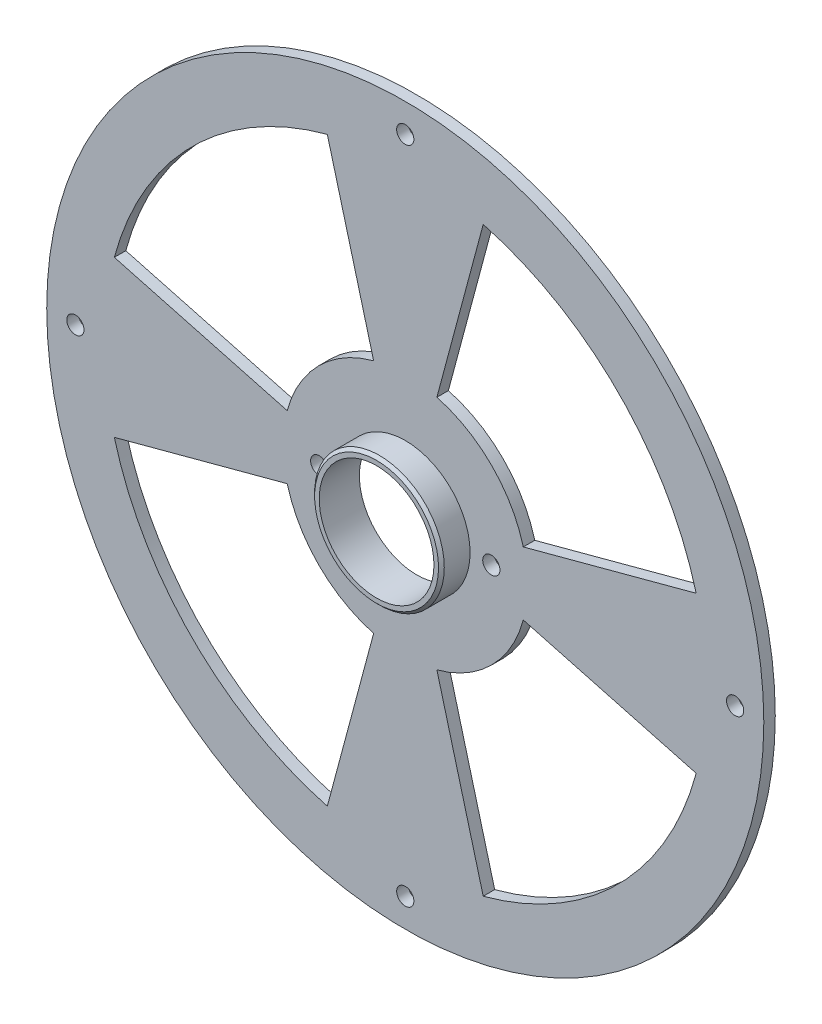
ISO-10303-21;
HEADER;
FILE_DESCRIPTION(('STEP AP214'),'2;1');
FILE_NAME('part.step','',(''),(''),'','','');
FILE_SCHEMA(('AUTOMOTIVE_DESIGN { 1 0 10303 214 1 1 1 1 }'));
ENDSEC;
DATA;
#1=APPLICATION_CONTEXT('core data for automotive mechanical design processes');
#2=APPLICATION_PROTOCOL_DEFINITION('international standard','automotive_design',2000,#1);
#3=PRODUCT_CONTEXT('',#1,'mechanical');
#4=PRODUCT('Part','Part','',(#3));
#5=PRODUCT_RELATED_PRODUCT_CATEGORY('part','',(#4));
#6=PRODUCT_DEFINITION_FORMATION('','',#4);
#7=PRODUCT_DEFINITION_CONTEXT('part definition',#1,'design');
#8=PRODUCT_DEFINITION('design','',#6,#7);
#9=PRODUCT_DEFINITION_SHAPE('','',#8);
#10=(LENGTH_UNIT() NAMED_UNIT(*) SI_UNIT(.MILLI.,.METRE.));
#11=(NAMED_UNIT(*) PLANE_ANGLE_UNIT() SI_UNIT($,.RADIAN.));
#12=(NAMED_UNIT(*) SI_UNIT($,.STERADIAN.) SOLID_ANGLE_UNIT());
#13=UNCERTAINTY_MEASURE_WITH_UNIT(LENGTH_MEASURE(1.E-05),#10,'distance_accuracy_value','');
#14=(GEOMETRIC_REPRESENTATION_CONTEXT(3) GLOBAL_UNCERTAINTY_ASSIGNED_CONTEXT((#13)) GLOBAL_UNIT_ASSIGNED_CONTEXT((#10,
#11,#12)) REPRESENTATION_CONTEXT('',''));
#15=CARTESIAN_POINT('',(0.,0.,0.));
#16=DIRECTION('',(0.,0.,1.));
#17=DIRECTION('',(1.,0.,0.));
#18=AXIS2_PLACEMENT_3D('',#15,#16,#17);
#19=CARTESIAN_POINT('',(0.,0.,2.));
#20=DIRECTION('',(0.,0.,1.));
#21=DIRECTION('',(1.,0.,0.));
#22=AXIS2_PLACEMENT_3D('',#19,#20,#21);
#23=PLANE('',#22);
#24=CARTESIAN_POINT('',(0.,0.,2.));
#25=DIRECTION('',(0.,0.,1.));
#26=DIRECTION('',(1.,0.,0.));
#27=AXIS2_PLACEMENT_3D('',#24,#25,#26);
#28=CIRCLE('',#27,52.5);
#29=CARTESIAN_POINT('',(-50.7111058801761,-13.5879998678824,2.));
#30=VERTEX_POINT('',#29);
#31=CARTESIAN_POINT('',(-13.587999867882,-50.7111058801762,2.));
#32=VERTEX_POINT('',#31);
#33=EDGE_CURVE('E50',#30,#32,#28,.T.);
#34=ORIENTED_EDGE('',*,*,#33,.F.);
#35=DIRECTION('',(-0.965925826289068,-0.258819045102522,0.));
#36=VECTOR('',#35,1.);
#37=CARTESIAN_POINT('',(-20.5742200999571,-5.51284566068371,2.));
#38=LINE('',#37,#36);
#39=CARTESIAN_POINT('',(-20.5742200999572,-5.5128456606837,2.));
#40=VERTEX_POINT('',#39);
#41=EDGE_CURVE('E169',#40,#30,#38,.T.);
#42=ORIENTED_EDGE('',*,*,#41,.F.);
#43=CARTESIAN_POINT('',(0.,0.,2.));
#44=DIRECTION('',(0.,0.,-1.));
#45=DIRECTION('',(1.,0.,0.));
#46=AXIS2_PLACEMENT_3D('',#43,#44,#45);
#47=CIRCLE('',#46,21.3);
#48=CARTESIAN_POINT('',(-5.51284566068355,-20.5742200999572,2.));
#49=VERTEX_POINT('',#48);
#50=EDGE_CURVE('E172',#49,#40,#47,.T.);
#51=ORIENTED_EDGE('',*,*,#50,.F.);
#52=DIRECTION('',(0.258819045102514,0.96592582628907,0.));
#53=VECTOR('',#52,1.);
#54=CARTESIAN_POINT('',(-5.51284566068355,-20.5742200999572,2.));
#55=LINE('',#54,#53);
#56=EDGE_CURVE('E181',#32,#49,#55,.T.);
#57=ORIENTED_EDGE('',*,*,#56,.F.);
#58=EDGE_LOOP('',(#34,#42,#51,#57));
#59=FACE_BOUND('',#58,.T.);
#60=CARTESIAN_POINT('',(0.,0.,2.));
#61=DIRECTION('',(0.,0.,1.));
#62=DIRECTION('',(1.,0.,0.));
#63=AXIS2_PLACEMENT_3D('',#60,#61,#62);
#64=CIRCLE('',#63,52.5);
#65=CARTESIAN_POINT('',(-13.5879998678824,50.7111058801761,2.));
#66=VERTEX_POINT('',#65);
#67=CARTESIAN_POINT('',(-50.7111058801762,13.587999867882,2.));
#68=VERTEX_POINT('',#67);
#69=EDGE_CURVE('E58',#66,#68,#64,.T.);
#70=ORIENTED_EDGE('',*,*,#69,.F.);
#71=DIRECTION('',(-0.258819045102522,0.965925826289068,0.));
#72=VECTOR('',#71,1.);
#73=CARTESIAN_POINT('',(-5.51284566068371,20.5742200999571,2.));
#74=LINE('',#73,#72);
#75=CARTESIAN_POINT('',(-5.51284566068371,20.5742200999572,2.));
#76=VERTEX_POINT('',#75);
#77=EDGE_CURVE('E196',#76,#66,#74,.T.);
#78=ORIENTED_EDGE('',*,*,#77,.F.);
#79=CARTESIAN_POINT('',(0.,0.,2.));
#80=DIRECTION('',(0.,0.,-1.));
#81=DIRECTION('',(1.,0.,0.));
#82=AXIS2_PLACEMENT_3D('',#79,#80,#81);
#83=CIRCLE('',#82,21.3);
#84=CARTESIAN_POINT('',(-20.5742200999572,5.51284566068355,2.));
#85=VERTEX_POINT('',#84);
#86=EDGE_CURVE('E211',#85,#76,#83,.T.);
#87=ORIENTED_EDGE('',*,*,#86,.F.);
#88=DIRECTION('',(0.96592582628907,-0.258819045102514,0.));
#89=VECTOR('',#88,1.);
#90=CARTESIAN_POINT('',(-20.5742200999572,5.51284566068355,2.));
#91=LINE('',#90,#89);
#92=EDGE_CURVE('E207',#68,#85,#91,.T.);
#93=ORIENTED_EDGE('',*,*,#92,.F.);
#94=EDGE_LOOP('',(#70,#78,#87,#93));
#95=FACE_BOUND('',#94,.T.);
#96=CARTESIAN_POINT('',(0.,0.,2.));
#97=DIRECTION('',(0.,0.,1.));
#98=DIRECTION('',(1.,0.,0.));
#99=AXIS2_PLACEMENT_3D('',#96,#97,#98);
#100=CIRCLE('',#99,52.5);
#101=CARTESIAN_POINT('',(50.7111058801761,13.5879998678824,2.));
#102=VERTEX_POINT('',#101);
#103=CARTESIAN_POINT('',(13.587999867882,50.7111058801762,2.));
#104=VERTEX_POINT('',#103);
#105=EDGE_CURVE('E236',#102,#104,#100,.T.);
#106=ORIENTED_EDGE('',*,*,#105,.F.);
#107=DIRECTION('',(0.965925826289068,0.258819045102522,0.));
#108=VECTOR('',#107,1.);
#109=CARTESIAN_POINT('',(20.5742200999571,5.51284566068371,2.));
#110=LINE('',#109,#108);
#111=CARTESIAN_POINT('',(20.5742200999571,5.51284566068371,2.));
#112=VERTEX_POINT('',#111);
#113=EDGE_CURVE('E226',#112,#102,#110,.T.);
#114=ORIENTED_EDGE('',*,*,#113,.F.);
#115=CARTESIAN_POINT('',(0.,0.,2.));
#116=DIRECTION('',(0.,0.,-1.));
#117=DIRECTION('',(1.,0.,0.));
#118=AXIS2_PLACEMENT_3D('',#115,#116,#117);
#119=CIRCLE('',#118,21.3);
#120=CARTESIAN_POINT('',(5.51284566068355,20.5742200999572,2.));
#121=VERTEX_POINT('',#120);
#122=EDGE_CURVE('E242',#121,#112,#119,.T.);
#123=ORIENTED_EDGE('',*,*,#122,.F.);
#124=DIRECTION('',(-0.258819045102514,-0.96592582628907,0.));
#125=VECTOR('',#124,1.);
#126=CARTESIAN_POINT('',(5.51284566068355,20.5742200999572,2.));
#127=LINE('',#126,#125);
#128=EDGE_CURVE('E238',#104,#121,#127,.T.);
#129=ORIENTED_EDGE('',*,*,#128,.F.);
#130=EDGE_LOOP('',(#106,#114,#123,#129));
#131=FACE_BOUND('',#130,.T.);
#132=CARTESIAN_POINT('',(0.,0.,2.));
#133=DIRECTION('',(0.,0.,1.));
#134=DIRECTION('',(1.,0.,0.));
#135=AXIS2_PLACEMENT_3D('',#132,#133,#134);
#136=CIRCLE('',#135,52.5);
#137=CARTESIAN_POINT('',(13.5879998678824,-50.7111058801761,2.));
#138=VERTEX_POINT('',#137);
#139=CARTESIAN_POINT('',(50.7111058801762,-13.587999867882,2.));
#140=VERTEX_POINT('',#139);
#141=EDGE_CURVE('E188',#138,#140,#136,.T.);
#142=ORIENTED_EDGE('',*,*,#141,.F.);
#143=DIRECTION('',(0.258819045102522,-0.965925826289068,0.));
#144=VECTOR('',#143,1.);
#145=CARTESIAN_POINT('',(5.51284566068371,-20.5742200999571,2.));
#146=LINE('',#145,#144);
#147=CARTESIAN_POINT('',(5.5128456606837,-20.5742200999572,2.));
#148=VERTEX_POINT('',#147);
#149=EDGE_CURVE('E258',#148,#138,#146,.T.);
#150=ORIENTED_EDGE('',*,*,#149,.F.);
#151=CARTESIAN_POINT('',(0.,0.,2.));
#152=DIRECTION('',(0.,0.,-1.));
#153=DIRECTION('',(1.,0.,0.));
#154=AXIS2_PLACEMENT_3D('',#151,#152,#153);
#155=CIRCLE('',#154,21.3);
#156=CARTESIAN_POINT('',(20.5742200999572,-5.51284566068355,2.));
#157=VERTEX_POINT('',#156);
#158=EDGE_CURVE('E272',#157,#148,#155,.T.);
#159=ORIENTED_EDGE('',*,*,#158,.F.);
#160=DIRECTION('',(-0.96592582628907,0.258819045102514,0.));
#161=VECTOR('',#160,1.);
#162=CARTESIAN_POINT('',(20.5742200999572,-5.51284566068355,2.));
#163=LINE('',#162,#161);
#164=EDGE_CURVE('E269',#140,#157,#163,.T.);
#165=ORIENTED_EDGE('',*,*,#164,.F.);
#166=EDGE_LOOP('',(#142,#150,#159,#165));
#167=FACE_BOUND('',#166,.T.);
#168=CARTESIAN_POINT('',(0.,0.,2.));
#169=DIRECTION('',(0.,0.,1.));
#170=DIRECTION('',(1.,0.,0.));
#171=AXIS2_PLACEMENT_3D('',#168,#169,#170);
#172=CIRCLE('',#171,11.3);
#173=CARTESIAN_POINT('',(11.3,0.,2.));
#174=VERTEX_POINT('',#173);
#175=EDGE_CURVE('E279',#174,#174,#172,.T.);
#176=ORIENTED_EDGE('',*,*,#175,.F.);
#177=EDGE_LOOP('',(#176));
#178=FACE_BOUND('',#177,.T.);
#179=CARTESIAN_POINT('',(-5.95238811855343E-13,-57.5,2.));
#180=DIRECTION('',(0.,0.,1.));
#181=DIRECTION('',(1.,0.,0.));
#182=AXIS2_PLACEMENT_3D('',#179,#180,#181);
#183=CIRCLE('',#182,1.50000000000001);
#184=CARTESIAN_POINT('',(1.49999999999941,-57.5,2.));
#185=VERTEX_POINT('',#184);
#186=EDGE_CURVE('E295',#185,#185,#183,.T.);
#187=ORIENTED_EDGE('',*,*,#186,.F.);
#188=EDGE_LOOP('',(#187));
#189=FACE_BOUND('',#188,.T.);
#190=CARTESIAN_POINT('',(1.93718457888383E-13,57.5,2.));
#191=DIRECTION('',(0.,0.,1.));
#192=DIRECTION('',(1.,0.,0.));
#193=AXIS2_PLACEMENT_3D('',#190,#191,#192);
#194=CIRCLE('',#193,1.5);
#195=CARTESIAN_POINT('',(1.5000000000002,57.5,2.));
#196=VERTEX_POINT('',#195);
#197=EDGE_CURVE('E307',#196,#196,#194,.T.);
#198=ORIENTED_EDGE('',*,*,#197,.F.);
#199=EDGE_LOOP('',(#198));
#200=FACE_BOUND('',#199,.T.);
#201=CARTESIAN_POINT('',(-57.5,0.,2.));
#202=DIRECTION('',(0.,0.,1.));
#203=DIRECTION('',(1.,0.,0.));
#204=AXIS2_PLACEMENT_3D('',#201,#202,#203);
#205=CIRCLE('',#204,1.5);
#206=CARTESIAN_POINT('',(-56.,0.,2.));
#207=VERTEX_POINT('',#206);
#208=EDGE_CURVE('E319',#207,#207,#205,.T.);
#209=ORIENTED_EDGE('',*,*,#208,.F.);
#210=EDGE_LOOP('',(#209));
#211=FACE_BOUND('',#210,.T.);
#212=CARTESIAN_POINT('',(0.,0.,2.));
#213=DIRECTION('',(0.,0.,1.));
#214=DIRECTION('',(1.,0.,0.));
#215=AXIS2_PLACEMENT_3D('',#212,#213,#214);
#216=CIRCLE('',#215,62.5);
#217=CARTESIAN_POINT('',(62.5,0.,2.));
#218=VERTEX_POINT('',#217);
#219=EDGE_CURVE('E325',#218,#218,#216,.T.);
#220=ORIENTED_EDGE('',*,*,#219,.T.);
#221=EDGE_LOOP('',(#220));
#222=FACE_BOUND('',#221,.T.);
#223=CARTESIAN_POINT('',(-15.,0.,2.));
#224=DIRECTION('',(0.,0.,1.));
#225=DIRECTION('',(1.,0.,0.));
#226=AXIS2_PLACEMENT_3D('',#223,#224,#225);
#227=CIRCLE('',#226,1.5);
#228=CARTESIAN_POINT('',(-13.5,0.,2.));
#229=VERTEX_POINT('',#228);
#230=EDGE_CURVE('E313',#229,#229,#227,.T.);
#231=ORIENTED_EDGE('',*,*,#230,.F.);
#232=EDGE_LOOP('',(#231));
#233=FACE_BOUND('',#232,.T.);
#234=CARTESIAN_POINT('',(57.5,-3.94478634871863E-13,2.));
#235=DIRECTION('',(0.,0.,1.));
#236=DIRECTION('',(1.,0.,0.));
#237=AXIS2_PLACEMENT_3D('',#234,#235,#236);
#238=CIRCLE('',#237,1.5);
#239=CARTESIAN_POINT('',(59.,-3.94478634871863E-13,2.));
#240=VERTEX_POINT('',#239);
#241=EDGE_CURVE('E301',#240,#240,#238,.T.);
#242=ORIENTED_EDGE('',*,*,#241,.F.);
#243=EDGE_LOOP('',(#242));
#244=FACE_BOUND('',#243,.T.);
#245=CARTESIAN_POINT('',(15.,0.,2.));
#246=DIRECTION('',(0.,0.,1.));
#247=DIRECTION('',(-1.,0.,0.));
#248=AXIS2_PLACEMENT_3D('',#245,#246,#247);
#249=CIRCLE('',#248,1.5);
#250=CARTESIAN_POINT('',(13.5,0.,2.));
#251=VERTEX_POINT('',#250);
#252=EDGE_CURVE('E289',#251,#251,#249,.T.);
#253=ORIENTED_EDGE('',*,*,#252,.F.);
#254=EDGE_LOOP('',(#253));
#255=FACE_BOUND('',#254,.T.);
#256=ADVANCED_FACE('F35',(#59,#95,#131,#167,#178,#189,#200,#211,#222,#233,#244,#255),#23,.T.);
#257=CARTESIAN_POINT('',(0.,0.,0.));
#258=DIRECTION('',(0.,0.,1.));
#259=DIRECTION('',(1.,0.,0.));
#260=AXIS2_PLACEMENT_3D('',#257,#258,#259);
#261=PLANE('',#260);
#262=CARTESIAN_POINT('',(0.,0.,0.));
#263=DIRECTION('',(0.,0.,1.));
#264=DIRECTION('',(1.,0.,0.));
#265=AXIS2_PLACEMENT_3D('',#262,#263,#264);
#266=CIRCLE('',#265,10.);
#267=CARTESIAN_POINT('',(10.,0.,0.));
#268=VERTEX_POINT('',#267);
#269=EDGE_CURVE('E239',#268,#268,#266,.T.);
#270=ORIENTED_EDGE('',*,*,#269,.T.);
#271=EDGE_LOOP('',(#270));
#272=FACE_BOUND('',#271,.T.);
#273=DIRECTION('',(-0.965925826289068,-0.258819045102522,0.));
#274=VECTOR('',#273,1.);
#275=CARTESIAN_POINT('',(-20.5742200999571,-5.51284566068371,0.));
#276=LINE('',#275,#274);
#277=CARTESIAN_POINT('',(-20.5742200999572,-5.5128456606837,0.));
#278=VERTEX_POINT('',#277);
#279=CARTESIAN_POINT('',(-50.7111058801761,-13.5879998678824,0.));
#280=VERTEX_POINT('',#279);
#281=EDGE_CURVE('E156',#278,#280,#276,.T.);
#282=ORIENTED_EDGE('',*,*,#281,.T.);
#283=CARTESIAN_POINT('',(0.,0.,0.));
#284=DIRECTION('',(0.,0.,1.));
#285=DIRECTION('',(1.,0.,0.));
#286=AXIS2_PLACEMENT_3D('',#283,#284,#285);
#287=CIRCLE('',#286,52.5);
#288=CARTESIAN_POINT('',(-13.587999867882,-50.7111058801762,0.));
#289=VERTEX_POINT('',#288);
#290=EDGE_CURVE('E150',#280,#289,#287,.T.);
#291=ORIENTED_EDGE('',*,*,#290,.T.);
#292=DIRECTION('',(0.258819045102514,0.96592582628907,0.));
#293=VECTOR('',#292,1.);
#294=CARTESIAN_POINT('',(-5.51284566068355,-20.5742200999572,0.));
#295=LINE('',#294,#293);
#296=CARTESIAN_POINT('',(-5.51284566068355,-20.5742200999572,0.));
#297=VERTEX_POINT('',#296);
#298=EDGE_CURVE('E160',#289,#297,#295,.T.);
#299=ORIENTED_EDGE('',*,*,#298,.T.);
#300=CARTESIAN_POINT('',(0.,0.,0.));
#301=DIRECTION('',(0.,0.,-1.));
#302=DIRECTION('',(1.,0.,0.));
#303=AXIS2_PLACEMENT_3D('',#300,#301,#302);
#304=CIRCLE('',#303,21.3);
#305=EDGE_CURVE('E164',#297,#278,#304,.T.);
#306=ORIENTED_EDGE('',*,*,#305,.T.);
#307=EDGE_LOOP('',(#282,#291,#299,#306));
#308=FACE_BOUND('',#307,.T.);
#309=DIRECTION('',(-0.258819045102522,0.965925826289068,0.));
#310=VECTOR('',#309,1.);
#311=CARTESIAN_POINT('',(-5.51284566068371,20.5742200999571,0.));
#312=LINE('',#311,#310);
#313=CARTESIAN_POINT('',(-5.51284566068371,20.5742200999572,0.));
#314=VERTEX_POINT('',#313);
#315=CARTESIAN_POINT('',(-13.5879998678824,50.7111058801761,0.));
#316=VERTEX_POINT('',#315);
#317=EDGE_CURVE('E202',#314,#316,#312,.T.);
#318=ORIENTED_EDGE('',*,*,#317,.T.);
#319=CARTESIAN_POINT('',(0.,0.,0.));
#320=DIRECTION('',(0.,0.,1.));
#321=DIRECTION('',(1.,0.,0.));
#322=AXIS2_PLACEMENT_3D('',#319,#320,#321);
#323=CIRCLE('',#322,52.5);
#324=CARTESIAN_POINT('',(-50.7111058801762,13.587999867882,0.));
#325=VERTEX_POINT('',#324);
#326=EDGE_CURVE('E192',#316,#325,#323,.T.);
#327=ORIENTED_EDGE('',*,*,#326,.T.);
#328=DIRECTION('',(0.96592582628907,-0.258819045102514,0.));
#329=VECTOR('',#328,1.);
#330=CARTESIAN_POINT('',(-20.5742200999572,5.51284566068355,0.));
#331=LINE('',#330,#329);
#332=CARTESIAN_POINT('',(-20.5742200999572,5.51284566068355,0.));
#333=VERTEX_POINT('',#332);
#334=EDGE_CURVE('E195',#325,#333,#331,.T.);
#335=ORIENTED_EDGE('',*,*,#334,.T.);
#336=CARTESIAN_POINT('',(0.,0.,0.));
#337=DIRECTION('',(0.,0.,-1.));
#338=DIRECTION('',(1.,0.,0.));
#339=AXIS2_PLACEMENT_3D('',#336,#337,#338);
#340=CIRCLE('',#339,21.3);
#341=EDGE_CURVE('E199',#333,#314,#340,.T.);
#342=ORIENTED_EDGE('',*,*,#341,.T.);
#343=EDGE_LOOP('',(#318,#327,#335,#342));
#344=FACE_BOUND('',#343,.T.);
#345=DIRECTION('',(0.965925826289068,0.258819045102522,0.));
#346=VECTOR('',#345,1.);
#347=CARTESIAN_POINT('',(20.5742200999571,5.51284566068371,0.));
#348=LINE('',#347,#346);
#349=CARTESIAN_POINT('',(20.5742200999571,5.51284566068371,0.));
#350=VERTEX_POINT('',#349);
#351=CARTESIAN_POINT('',(50.7111058801761,13.5879998678824,0.));
#352=VERTEX_POINT('',#351);
#353=EDGE_CURVE('E232',#350,#352,#348,.T.);
#354=ORIENTED_EDGE('',*,*,#353,.T.);
#355=CARTESIAN_POINT('',(0.,0.,0.));
#356=DIRECTION('',(0.,0.,1.));
#357=DIRECTION('',(1.,0.,0.));
#358=AXIS2_PLACEMENT_3D('',#355,#356,#357);
#359=CIRCLE('',#358,52.5);
#360=CARTESIAN_POINT('',(13.587999867882,50.7111058801762,0.));
#361=VERTEX_POINT('',#360);
#362=EDGE_CURVE('E222',#352,#361,#359,.T.);
#363=ORIENTED_EDGE('',*,*,#362,.T.);
#364=DIRECTION('',(-0.258819045102514,-0.96592582628907,0.));
#365=VECTOR('',#364,1.);
#366=CARTESIAN_POINT('',(5.51284566068355,20.5742200999572,0.));
#367=LINE('',#366,#365);
#368=CARTESIAN_POINT('',(5.51284566068355,20.5742200999572,0.));
#369=VERTEX_POINT('',#368);
#370=EDGE_CURVE('E225',#361,#369,#367,.T.);
#371=ORIENTED_EDGE('',*,*,#370,.T.);
#372=CARTESIAN_POINT('',(0.,0.,0.));
#373=DIRECTION('',(0.,0.,-1.));
#374=DIRECTION('',(1.,0.,0.));
#375=AXIS2_PLACEMENT_3D('',#372,#373,#374);
#376=CIRCLE('',#375,21.3);
#377=EDGE_CURVE('E229',#369,#350,#376,.T.);
#378=ORIENTED_EDGE('',*,*,#377,.T.);
#379=EDGE_LOOP('',(#354,#363,#371,#378));
#380=FACE_BOUND('',#379,.T.);
#381=DIRECTION('',(0.258819045102522,-0.965925826289068,0.));
#382=VECTOR('',#381,1.);
#383=CARTESIAN_POINT('',(5.51284566068371,-20.5742200999571,0.));
#384=LINE('',#383,#382);
#385=CARTESIAN_POINT('',(5.5128456606837,-20.5742200999572,0.));
#386=VERTEX_POINT('',#385);
#387=CARTESIAN_POINT('',(13.5879998678824,-50.7111058801761,0.));
#388=VERTEX_POINT('',#387);
#389=EDGE_CURVE('E264',#386,#388,#384,.T.);
#390=ORIENTED_EDGE('',*,*,#389,.T.);
#391=CARTESIAN_POINT('',(0.,0.,0.));
#392=DIRECTION('',(0.,0.,1.));
#393=DIRECTION('',(1.,0.,0.));
#394=AXIS2_PLACEMENT_3D('',#391,#392,#393);
#395=CIRCLE('',#394,52.5);
#396=CARTESIAN_POINT('',(50.7111058801762,-13.587999867882,0.));
#397=VERTEX_POINT('',#396);
#398=EDGE_CURVE('E254',#388,#397,#395,.T.);
#399=ORIENTED_EDGE('',*,*,#398,.T.);
#400=DIRECTION('',(-0.96592582628907,0.258819045102514,0.));
#401=VECTOR('',#400,1.);
#402=CARTESIAN_POINT('',(20.5742200999572,-5.51284566068355,0.));
#403=LINE('',#402,#401);
#404=CARTESIAN_POINT('',(20.5742200999572,-5.51284566068355,0.));
#405=VERTEX_POINT('',#404);
#406=EDGE_CURVE('E257',#397,#405,#403,.T.);
#407=ORIENTED_EDGE('',*,*,#406,.T.);
#408=CARTESIAN_POINT('',(0.,0.,0.));
#409=DIRECTION('',(0.,0.,-1.));
#410=DIRECTION('',(1.,0.,0.));
#411=AXIS2_PLACEMENT_3D('',#408,#409,#410);
#412=CIRCLE('',#411,21.3);
#413=EDGE_CURVE('E261',#405,#386,#412,.T.);
#414=ORIENTED_EDGE('',*,*,#413,.T.);
#415=EDGE_LOOP('',(#390,#399,#407,#414));
#416=FACE_BOUND('',#415,.T.);
#417=CARTESIAN_POINT('',(0.,0.,0.));
#418=DIRECTION('',(0.,0.,1.));
#419=DIRECTION('',(1.,0.,0.));
#420=AXIS2_PLACEMENT_3D('',#417,#418,#419);
#421=CIRCLE('',#420,62.5);
#422=CARTESIAN_POINT('',(62.5,0.,0.));
#423=VERTEX_POINT('',#422);
#424=EDGE_CURVE('E322',#423,#423,#421,.T.);
#425=ORIENTED_EDGE('',*,*,#424,.F.);
#426=EDGE_LOOP('',(#425));
#427=FACE_BOUND('',#426,.T.);
#428=CARTESIAN_POINT('',(-57.5,0.,0.));
#429=DIRECTION('',(0.,0.,1.));
#430=DIRECTION('',(1.,0.,0.));
#431=AXIS2_PLACEMENT_3D('',#428,#429,#430);
#432=CIRCLE('',#431,1.5);
#433=CARTESIAN_POINT('',(-56.,0.,0.));
#434=VERTEX_POINT('',#433);
#435=EDGE_CURVE('E316',#434,#434,#432,.T.);
#436=ORIENTED_EDGE('',*,*,#435,.T.);
#437=EDGE_LOOP('',(#436));
#438=FACE_BOUND('',#437,.T.);
#439=CARTESIAN_POINT('',(-15.,0.,0.));
#440=DIRECTION('',(0.,0.,1.));
#441=DIRECTION('',(1.,0.,0.));
#442=AXIS2_PLACEMENT_3D('',#439,#440,#441);
#443=CIRCLE('',#442,1.5);
#444=CARTESIAN_POINT('',(-13.5,0.,0.));
#445=VERTEX_POINT('',#444);
#446=EDGE_CURVE('E310',#445,#445,#443,.T.);
#447=ORIENTED_EDGE('',*,*,#446,.T.);
#448=EDGE_LOOP('',(#447));
#449=FACE_BOUND('',#448,.T.);
#450=CARTESIAN_POINT('',(1.93718457888383E-13,57.5,0.));
#451=DIRECTION('',(0.,0.,1.));
#452=DIRECTION('',(1.,0.,0.));
#453=AXIS2_PLACEMENT_3D('',#450,#451,#452);
#454=CIRCLE('',#453,1.5);
#455=CARTESIAN_POINT('',(1.5000000000002,57.5,0.));
#456=VERTEX_POINT('',#455);
#457=EDGE_CURVE('E304',#456,#456,#454,.T.);
#458=ORIENTED_EDGE('',*,*,#457,.T.);
#459=EDGE_LOOP('',(#458));
#460=FACE_BOUND('',#459,.T.);
#461=CARTESIAN_POINT('',(57.5,-3.94478634871863E-13,0.));
#462=DIRECTION('',(0.,0.,1.));
#463=DIRECTION('',(1.,0.,0.));
#464=AXIS2_PLACEMENT_3D('',#461,#462,#463);
#465=CIRCLE('',#464,1.5);
#466=CARTESIAN_POINT('',(59.,-3.94478634871863E-13,0.));
#467=VERTEX_POINT('',#466);
#468=EDGE_CURVE('E298',#467,#467,#465,.T.);
#469=ORIENTED_EDGE('',*,*,#468,.T.);
#470=EDGE_LOOP('',(#469));
#471=FACE_BOUND('',#470,.T.);
#472=CARTESIAN_POINT('',(-5.95238811855343E-13,-57.5,0.));
#473=DIRECTION('',(0.,0.,1.));
#474=DIRECTION('',(1.,0.,0.));
#475=AXIS2_PLACEMENT_3D('',#472,#473,#474);
#476=CIRCLE('',#475,1.50000000000001);
#477=CARTESIAN_POINT('',(1.49999999999941,-57.5,0.));
#478=VERTEX_POINT('',#477);
#479=EDGE_CURVE('E292',#478,#478,#476,.T.);
#480=ORIENTED_EDGE('',*,*,#479,.T.);
#481=EDGE_LOOP('',(#480));
#482=FACE_BOUND('',#481,.T.);
#483=CARTESIAN_POINT('',(15.,0.,0.));
#484=DIRECTION('',(0.,0.,1.));
#485=DIRECTION('',(-1.,0.,0.));
#486=AXIS2_PLACEMENT_3D('',#483,#484,#485);
#487=CIRCLE('',#486,1.5);
#488=CARTESIAN_POINT('',(13.5,0.,0.));
#489=VERTEX_POINT('',#488);
#490=EDGE_CURVE('E288',#489,#489,#487,.T.);
#491=ORIENTED_EDGE('',*,*,#490,.T.);
#492=EDGE_LOOP('',(#491));
#493=FACE_BOUND('',#492,.T.);
#494=ADVANCED_FACE('F166',(#272,#308,#344,#380,#416,#427,#438,#449,#460,#471,#482,#493),#261,.F.);
#495=CARTESIAN_POINT('',(0.,0.,2.));
#496=DIRECTION('',(0.,0.,-1.));
#497=DIRECTION('',(-1.,0.,0.));
#498=AXIS2_PLACEMENT_3D('',#495,#496,#497);
#499=CYLINDRICAL_SURFACE('',#498,62.5);
#500=ORIENTED_EDGE('',*,*,#219,.F.);
#501=EDGE_LOOP('',(#500));
#502=FACE_BOUND('',#501,.T.);
#503=ORIENTED_EDGE('',*,*,#424,.T.);
#504=EDGE_LOOP('',(#503));
#505=FACE_BOUND('',#504,.T.);
#506=ADVANCED_FACE('F350',(#502,#505),#499,.T.);
#507=CARTESIAN_POINT('',(-57.5,0.,2.));
#508=DIRECTION('',(0.,0.,-1.));
#509=DIRECTION('',(-1.,0.,0.));
#510=AXIS2_PLACEMENT_3D('',#507,#508,#509);
#511=CYLINDRICAL_SURFACE('',#510,1.5);
#512=ORIENTED_EDGE('',*,*,#208,.T.);
#513=EDGE_LOOP('',(#512));
#514=FACE_BOUND('',#513,.T.);
#515=ORIENTED_EDGE('',*,*,#435,.F.);
#516=EDGE_LOOP('',(#515));
#517=FACE_BOUND('',#516,.T.);
#518=ADVANCED_FACE('F355',(#514,#517),#511,.F.);
#519=CARTESIAN_POINT('',(-15.,0.,2.));
#520=DIRECTION('',(0.,0.,-1.));
#521=DIRECTION('',(-1.,0.,0.));
#522=AXIS2_PLACEMENT_3D('',#519,#520,#521);
#523=CYLINDRICAL_SURFACE('',#522,1.5);
#524=ORIENTED_EDGE('',*,*,#230,.T.);
#525=EDGE_LOOP('',(#524));
#526=FACE_BOUND('',#525,.T.);
#527=ORIENTED_EDGE('',*,*,#446,.F.);
#528=EDGE_LOOP('',(#527));
#529=FACE_BOUND('',#528,.T.);
#530=ADVANCED_FACE('F362',(#526,#529),#523,.F.);
#531=CARTESIAN_POINT('',(1.93718457888383E-13,57.5,2.));
#532=DIRECTION('',(0.,0.,-1.));
#533=DIRECTION('',(-1.,0.,0.));
#534=AXIS2_PLACEMENT_3D('',#531,#532,#533);
#535=CYLINDRICAL_SURFACE('',#534,1.5);
#536=ORIENTED_EDGE('',*,*,#197,.T.);
#537=EDGE_LOOP('',(#536));
#538=FACE_BOUND('',#537,.T.);
#539=ORIENTED_EDGE('',*,*,#457,.F.);
#540=EDGE_LOOP('',(#539));
#541=FACE_BOUND('',#540,.T.);
#542=ADVANCED_FACE('F400',(#538,#541),#535,.F.);
#543=CARTESIAN_POINT('',(57.5,-3.94478634871863E-13,2.));
#544=DIRECTION('',(0.,0.,-1.));
#545=DIRECTION('',(-1.,0.,0.));
#546=AXIS2_PLACEMENT_3D('',#543,#544,#545);
#547=CYLINDRICAL_SURFACE('',#546,1.5);
#548=ORIENTED_EDGE('',*,*,#241,.T.);
#549=EDGE_LOOP('',(#548));
#550=FACE_BOUND('',#549,.T.);
#551=ORIENTED_EDGE('',*,*,#468,.F.);
#552=EDGE_LOOP('',(#551));
#553=FACE_BOUND('',#552,.T.);
#554=ADVANCED_FACE('F393',(#550,#553),#547,.F.);
#555=CARTESIAN_POINT('',(-5.95238811855343E-13,-57.5,2.));
#556=DIRECTION('',(0.,0.,-1.));
#557=DIRECTION('',(-1.,0.,0.));
#558=AXIS2_PLACEMENT_3D('',#555,#556,#557);
#559=CYLINDRICAL_SURFACE('',#558,1.50000000000001);
#560=ORIENTED_EDGE('',*,*,#186,.T.);
#561=EDGE_LOOP('',(#560));
#562=FACE_BOUND('',#561,.T.);
#563=ORIENTED_EDGE('',*,*,#479,.F.);
#564=EDGE_LOOP('',(#563));
#565=FACE_BOUND('',#564,.T.);
#566=ADVANCED_FACE('F384',(#562,#565),#559,.F.);
#567=CARTESIAN_POINT('',(15.,0.,2.));
#568=DIRECTION('',(0.,0.,-1.));
#569=DIRECTION('',(-1.,0.,0.));
#570=AXIS2_PLACEMENT_3D('',#567,#568,#569);
#571=CYLINDRICAL_SURFACE('',#570,1.5);
#572=ORIENTED_EDGE('',*,*,#252,.T.);
#573=EDGE_LOOP('',(#572));
#574=FACE_BOUND('',#573,.T.);
#575=ORIENTED_EDGE('',*,*,#490,.F.);
#576=EDGE_LOOP('',(#575));
#577=FACE_BOUND('',#576,.T.);
#578=ADVANCED_FACE('F381',(#574,#577),#571,.F.);
#579=CARTESIAN_POINT('',(0.,0.,7.));
#580=DIRECTION('',(0.,0.,-1.));
#581=DIRECTION('',(-1.,0.,0.));
#582=AXIS2_PLACEMENT_3D('',#579,#580,#581);
#583=CYLINDRICAL_SURFACE('',#582,11.3);
#584=CARTESIAN_POINT('',(0.,0.,6.50000000000002));
#585=DIRECTION('',(0.,0.,1.));
#586=DIRECTION('',(1.,0.,0.));
#587=AXIS2_PLACEMENT_3D('',#584,#585,#586);
#588=CIRCLE('',#587,11.3);
#589=CARTESIAN_POINT('',(11.3,0.,6.50000000000002));
#590=VERTEX_POINT('',#589);
#591=EDGE_CURVE('E11',#590,#590,#588,.F.);
#592=ORIENTED_EDGE('',*,*,#591,.T.);
#593=EDGE_LOOP('',(#592));
#594=FACE_BOUND('',#593,.T.);
#595=ORIENTED_EDGE('',*,*,#175,.T.);
#596=EDGE_LOOP('',(#595));
#597=FACE_BOUND('',#596,.T.);
#598=ADVANCED_FACE('F383',(#594,#597),#583,.T.);
#599=CARTESIAN_POINT('',(0.,0.,7.));
#600=DIRECTION('',(0.,0.,1.));
#601=DIRECTION('',(1.,0.,0.));
#602=AXIS2_PLACEMENT_3D('',#599,#600,#601);
#603=PLANE('',#602);
#604=CARTESIAN_POINT('',(0.,0.,7.));
#605=DIRECTION('',(0.,0.,1.));
#606=DIRECTION('',(1.,0.,0.));
#607=AXIS2_PLACEMENT_3D('',#604,#605,#606);
#608=CIRCLE('',#607,10.8);
#609=CARTESIAN_POINT('',(10.8,0.,7.));
#610=VERTEX_POINT('',#609);
#611=EDGE_CURVE('E43',#610,#610,#608,.T.);
#612=ORIENTED_EDGE('',*,*,#611,.T.);
#613=EDGE_LOOP('',(#612));
#614=FACE_BOUND('',#613,.T.);
#615=CARTESIAN_POINT('',(0.,0.,7.));
#616=DIRECTION('',(0.,0.,1.));
#617=DIRECTION('',(1.,0.,0.));
#618=AXIS2_PLACEMENT_3D('',#615,#616,#617);
#619=CIRCLE('',#618,10.);
#620=CARTESIAN_POINT('',(10.,0.,7.));
#621=VERTEX_POINT('',#620);
#622=EDGE_CURVE('E175',#621,#621,#619,.T.);
#623=ORIENTED_EDGE('',*,*,#622,.F.);
#624=EDGE_LOOP('',(#623));
#625=FACE_BOUND('',#624,.T.);
#626=ADVANCED_FACE('F332',(#614,#625),#603,.T.);
#627=CARTESIAN_POINT('',(0.,0.,0.));
#628=DIRECTION('',(0.,0.,1.));
#629=DIRECTION('',(1.,0.,0.));
#630=AXIS2_PLACEMENT_3D('',#627,#628,#629);
#631=CYLINDRICAL_SURFACE('',#630,52.5);
#632=ORIENTED_EDGE('',*,*,#141,.T.);
#633=DIRECTION('',(0.,0.,1.));
#634=VECTOR('',#633,1.);
#635=CARTESIAN_POINT('',(50.7111058801762,-13.587999867882,0.));
#636=LINE('',#635,#634);
#637=EDGE_CURVE('E267',#397,#140,#636,.T.);
#638=ORIENTED_EDGE('',*,*,#637,.F.);
#639=ORIENTED_EDGE('',*,*,#398,.F.);
#640=DIRECTION('',(0.,0.,1.));
#641=VECTOR('',#640,1.);
#642=CARTESIAN_POINT('',(13.5879998678824,-50.7111058801761,0.));
#643=LINE('',#642,#641);
#644=EDGE_CURVE('E277',#388,#138,#643,.T.);
#645=ORIENTED_EDGE('',*,*,#644,.T.);
#646=EDGE_LOOP('',(#632,#638,#639,#645));
#647=FACE_BOUND('',#646,.T.);
#648=ADVANCED_FACE('F445',(#647),#631,.F.);
#649=CARTESIAN_POINT('',(5.51284566068371,-20.5742200999571,0.));
#650=DIRECTION('',(-0.965925826289068,-0.258819045102522,0.));
#651=DIRECTION('',(0.258819045102522,-0.965925826289068,0.));
#652=AXIS2_PLACEMENT_3D('',#649,#650,#651);
#653=PLANE('',#652);
#654=ORIENTED_EDGE('',*,*,#149,.T.);
#655=ORIENTED_EDGE('',*,*,#644,.F.);
#656=ORIENTED_EDGE('',*,*,#389,.F.);
#657=DIRECTION('',(0.,0.,1.));
#658=VECTOR('',#657,1.);
#659=CARTESIAN_POINT('',(5.5128456606837,-20.5742200999572,0.));
#660=LINE('',#659,#658);
#661=EDGE_CURVE('E280',#386,#148,#660,.T.);
#662=ORIENTED_EDGE('',*,*,#661,.T.);
#663=EDGE_LOOP('',(#654,#655,#656,#662));
#664=FACE_BOUND('',#663,.T.);
#665=ADVANCED_FACE('F450',(#664),#653,.F.);
#666=CARTESIAN_POINT('',(0.,0.,0.));
#667=DIRECTION('',(0.,0.,1.));
#668=DIRECTION('',(1.,0.,0.));
#669=AXIS2_PLACEMENT_3D('',#666,#667,#668);
#670=CYLINDRICAL_SURFACE('',#669,21.3);
#671=ORIENTED_EDGE('',*,*,#158,.T.);
#672=ORIENTED_EDGE('',*,*,#661,.F.);
#673=ORIENTED_EDGE('',*,*,#413,.F.);
#674=DIRECTION('',(0.,0.,1.));
#675=VECTOR('',#674,1.);
#676=CARTESIAN_POINT('',(20.5742200999572,-5.51284566068355,0.));
#677=LINE('',#676,#675);
#678=EDGE_CURVE('E282',#405,#157,#677,.T.);
#679=ORIENTED_EDGE('',*,*,#678,.T.);
#680=EDGE_LOOP('',(#671,#672,#673,#679));
#681=FACE_BOUND('',#680,.T.);
#682=ADVANCED_FACE('F462',(#681),#670,.T.);
#683=CARTESIAN_POINT('',(20.5742200999572,-5.51284566068355,0.));
#684=DIRECTION('',(0.258819045102514,0.96592582628907,0.));
#685=DIRECTION('',(-0.96592582628907,0.258819045102514,0.));
#686=AXIS2_PLACEMENT_3D('',#683,#684,#685);
#687=PLANE('',#686);
#688=ORIENTED_EDGE('',*,*,#164,.T.);
#689=ORIENTED_EDGE('',*,*,#678,.F.);
#690=ORIENTED_EDGE('',*,*,#406,.F.);
#691=ORIENTED_EDGE('',*,*,#637,.T.);
#692=EDGE_LOOP('',(#688,#689,#690,#691));
#693=FACE_BOUND('',#692,.T.);
#694=ADVANCED_FACE('F472',(#693),#687,.F.);
#695=CARTESIAN_POINT('',(0.,0.,0.));
#696=DIRECTION('',(0.,0.,1.));
#697=DIRECTION('',(1.,0.,0.));
#698=AXIS2_PLACEMENT_3D('',#695,#696,#697);
#699=CYLINDRICAL_SURFACE('',#698,52.5);
#700=ORIENTED_EDGE('',*,*,#105,.T.);
#701=DIRECTION('',(0.,0.,1.));
#702=VECTOR('',#701,1.);
#703=CARTESIAN_POINT('',(13.587999867882,50.7111058801762,0.));
#704=LINE('',#703,#702);
#705=EDGE_CURVE('E235',#361,#104,#704,.T.);
#706=ORIENTED_EDGE('',*,*,#705,.F.);
#707=ORIENTED_EDGE('',*,*,#362,.F.);
#708=DIRECTION('',(0.,0.,1.));
#709=VECTOR('',#708,1.);
#710=CARTESIAN_POINT('',(50.7111058801761,13.5879998678824,0.));
#711=LINE('',#710,#709);
#712=EDGE_CURVE('E208',#352,#102,#711,.T.);
#713=ORIENTED_EDGE('',*,*,#712,.T.);
#714=EDGE_LOOP('',(#700,#706,#707,#713));
#715=FACE_BOUND('',#714,.T.);
#716=ADVANCED_FACE('F482',(#715),#699,.F.);
#717=CARTESIAN_POINT('',(20.5742200999571,5.51284566068371,0.));
#718=DIRECTION('',(0.258819045102522,-0.965925826289068,0.));
#719=DIRECTION('',(0.965925826289068,0.258819045102522,0.));
#720=AXIS2_PLACEMENT_3D('',#717,#718,#719);
#721=PLANE('',#720);
#722=ORIENTED_EDGE('',*,*,#113,.T.);
#723=ORIENTED_EDGE('',*,*,#712,.F.);
#724=ORIENTED_EDGE('',*,*,#353,.F.);
#725=DIRECTION('',(0.,0.,1.));
#726=VECTOR('',#725,1.);
#727=CARTESIAN_POINT('',(20.5742200999571,5.51284566068371,0.));
#728=LINE('',#727,#726);
#729=EDGE_CURVE('E248',#350,#112,#728,.T.);
#730=ORIENTED_EDGE('',*,*,#729,.T.);
#731=EDGE_LOOP('',(#722,#723,#724,#730));
#732=FACE_BOUND('',#731,.T.);
#733=ADVANCED_FACE('F492',(#732),#721,.F.);
#734=CARTESIAN_POINT('',(0.,0.,0.));
#735=DIRECTION('',(0.,0.,1.));
#736=DIRECTION('',(1.,0.,0.));
#737=AXIS2_PLACEMENT_3D('',#734,#735,#736);
#738=CYLINDRICAL_SURFACE('',#737,21.3);
#739=ORIENTED_EDGE('',*,*,#122,.T.);
#740=ORIENTED_EDGE('',*,*,#729,.F.);
#741=ORIENTED_EDGE('',*,*,#377,.F.);
#742=DIRECTION('',(0.,0.,1.));
#743=VECTOR('',#742,1.);
#744=CARTESIAN_POINT('',(5.51284566068355,20.5742200999572,0.));
#745=LINE('',#744,#743);
#746=EDGE_CURVE('E250',#369,#121,#745,.T.);
#747=ORIENTED_EDGE('',*,*,#746,.T.);
#748=EDGE_LOOP('',(#739,#740,#741,#747));
#749=FACE_BOUND('',#748,.T.);
#750=ADVANCED_FACE('F502',(#749),#738,.T.);
#751=CARTESIAN_POINT('',(5.51284566068355,20.5742200999572,0.));
#752=DIRECTION('',(-0.96592582628907,0.258819045102514,0.));
#753=DIRECTION('',(-0.258819045102514,-0.96592582628907,0.));
#754=AXIS2_PLACEMENT_3D('',#751,#752,#753);
#755=PLANE('',#754);
#756=ORIENTED_EDGE('',*,*,#128,.T.);
#757=ORIENTED_EDGE('',*,*,#746,.F.);
#758=ORIENTED_EDGE('',*,*,#370,.F.);
#759=ORIENTED_EDGE('',*,*,#705,.T.);
#760=EDGE_LOOP('',(#756,#757,#758,#759));
#761=FACE_BOUND('',#760,.T.);
#762=ADVANCED_FACE('F512',(#761),#755,.F.);
#763=CARTESIAN_POINT('',(0.,0.,0.));
#764=DIRECTION('',(0.,0.,1.));
#765=DIRECTION('',(1.,0.,0.));
#766=AXIS2_PLACEMENT_3D('',#763,#764,#765);
#767=CYLINDRICAL_SURFACE('',#766,52.5);
#768=ORIENTED_EDGE('',*,*,#69,.T.);
#769=DIRECTION('',(0.,0.,1.));
#770=VECTOR('',#769,1.);
#771=CARTESIAN_POINT('',(-50.7111058801762,13.587999867882,0.));
#772=LINE('',#771,#770);
#773=EDGE_CURVE('E205',#325,#68,#772,.T.);
#774=ORIENTED_EDGE('',*,*,#773,.F.);
#775=ORIENTED_EDGE('',*,*,#326,.F.);
#776=DIRECTION('',(0.,0.,1.));
#777=VECTOR('',#776,1.);
#778=CARTESIAN_POINT('',(-13.5879998678824,50.7111058801761,0.));
#779=LINE('',#778,#777);
#780=EDGE_CURVE('E182',#316,#66,#779,.T.);
#781=ORIENTED_EDGE('',*,*,#780,.T.);
#782=EDGE_LOOP('',(#768,#774,#775,#781));
#783=FACE_BOUND('',#782,.T.);
#784=ADVANCED_FACE('F522',(#783),#767,.F.);
#785=CARTESIAN_POINT('',(-5.51284566068371,20.5742200999571,0.));
#786=DIRECTION('',(0.965925826289068,0.258819045102522,0.));
#787=DIRECTION('',(-0.258819045102522,0.965925826289068,0.));
#788=AXIS2_PLACEMENT_3D('',#785,#786,#787);
#789=PLANE('',#788);
#790=ORIENTED_EDGE('',*,*,#77,.T.);
#791=ORIENTED_EDGE('',*,*,#780,.F.);
#792=ORIENTED_EDGE('',*,*,#317,.F.);
#793=DIRECTION('',(0.,0.,1.));
#794=VECTOR('',#793,1.);
#795=CARTESIAN_POINT('',(-5.51284566068371,20.5742200999572,0.));
#796=LINE('',#795,#794);
#797=EDGE_CURVE('E217',#314,#76,#796,.T.);
#798=ORIENTED_EDGE('',*,*,#797,.T.);
#799=EDGE_LOOP('',(#790,#791,#792,#798));
#800=FACE_BOUND('',#799,.T.);
#801=ADVANCED_FACE('F532',(#800),#789,.F.);
#802=CARTESIAN_POINT('',(0.,0.,0.));
#803=DIRECTION('',(0.,0.,1.));
#804=DIRECTION('',(1.,0.,0.));
#805=AXIS2_PLACEMENT_3D('',#802,#803,#804);
#806=CYLINDRICAL_SURFACE('',#805,21.3);
#807=ORIENTED_EDGE('',*,*,#86,.T.);
#808=ORIENTED_EDGE('',*,*,#797,.F.);
#809=ORIENTED_EDGE('',*,*,#341,.F.);
#810=DIRECTION('',(0.,0.,1.));
#811=VECTOR('',#810,1.);
#812=CARTESIAN_POINT('',(-20.5742200999572,5.51284566068355,0.));
#813=LINE('',#812,#811);
#814=EDGE_CURVE('E219',#333,#85,#813,.T.);
#815=ORIENTED_EDGE('',*,*,#814,.T.);
#816=EDGE_LOOP('',(#807,#808,#809,#815));
#817=FACE_BOUND('',#816,.T.);
#818=ADVANCED_FACE('F541',(#817),#806,.T.);
#819=CARTESIAN_POINT('',(-20.5742200999572,5.51284566068355,0.));
#820=DIRECTION('',(-0.258819045102514,-0.96592582628907,0.));
#821=DIRECTION('',(0.96592582628907,-0.258819045102514,0.));
#822=AXIS2_PLACEMENT_3D('',#819,#820,#821);
#823=PLANE('',#822);
#824=ORIENTED_EDGE('',*,*,#92,.T.);
#825=ORIENTED_EDGE('',*,*,#814,.F.);
#826=ORIENTED_EDGE('',*,*,#334,.F.);
#827=ORIENTED_EDGE('',*,*,#773,.T.);
#828=EDGE_LOOP('',(#824,#825,#826,#827));
#829=FACE_BOUND('',#828,.T.);
#830=ADVANCED_FACE('F551',(#829),#823,.F.);
#831=CARTESIAN_POINT('',(0.,0.,0.));
#832=DIRECTION('',(0.,0.,1.));
#833=DIRECTION('',(1.,0.,0.));
#834=AXIS2_PLACEMENT_3D('',#831,#832,#833);
#835=CYLINDRICAL_SURFACE('',#834,52.5);
#836=ORIENTED_EDGE('',*,*,#33,.T.);
#837=DIRECTION('',(0.,0.,1.));
#838=VECTOR('',#837,1.);
#839=CARTESIAN_POINT('',(-13.587999867882,-50.7111058801762,0.));
#840=LINE('',#839,#838);
#841=EDGE_CURVE('E146',#289,#32,#840,.T.);
#842=ORIENTED_EDGE('',*,*,#841,.F.);
#843=ORIENTED_EDGE('',*,*,#290,.F.);
#844=DIRECTION('',(0.,0.,1.));
#845=VECTOR('',#844,1.);
#846=CARTESIAN_POINT('',(-50.7111058801761,-13.5879998678824,0.));
#847=LINE('',#846,#845);
#848=EDGE_CURVE('E186',#280,#30,#847,.T.);
#849=ORIENTED_EDGE('',*,*,#848,.T.);
#850=EDGE_LOOP('',(#836,#842,#843,#849));
#851=FACE_BOUND('',#850,.T.);
#852=ADVANCED_FACE('F148',(#851),#835,.F.);
#853=CARTESIAN_POINT('',(-20.5742200999571,-5.51284566068371,0.));
#854=DIRECTION('',(-0.258819045102522,0.965925826289068,0.));
#855=DIRECTION('',(-0.965925826289068,-0.258819045102522,0.));
#856=AXIS2_PLACEMENT_3D('',#853,#854,#855);
#857=PLANE('',#856);
#858=ORIENTED_EDGE('',*,*,#41,.T.);
#859=ORIENTED_EDGE('',*,*,#848,.F.);
#860=ORIENTED_EDGE('',*,*,#281,.F.);
#861=DIRECTION('',(0.,0.,1.));
#862=VECTOR('',#861,1.);
#863=CARTESIAN_POINT('',(-20.5742200999572,-5.5128456606837,0.));
#864=LINE('',#863,#862);
#865=EDGE_CURVE('E189',#278,#40,#864,.T.);
#866=ORIENTED_EDGE('',*,*,#865,.T.);
#867=EDGE_LOOP('',(#858,#859,#860,#866));
#868=FACE_BOUND('',#867,.T.);
#869=ADVANCED_FACE('F570',(#868),#857,.F.);
#870=CARTESIAN_POINT('',(0.,0.,0.));
#871=DIRECTION('',(0.,0.,1.));
#872=DIRECTION('',(1.,0.,0.));
#873=AXIS2_PLACEMENT_3D('',#870,#871,#872);
#874=CYLINDRICAL_SURFACE('',#873,21.3);
#875=ORIENTED_EDGE('',*,*,#50,.T.);
#876=ORIENTED_EDGE('',*,*,#865,.F.);
#877=ORIENTED_EDGE('',*,*,#305,.F.);
#878=DIRECTION('',(0.,0.,1.));
#879=VECTOR('',#878,1.);
#880=CARTESIAN_POINT('',(-5.51284566068355,-20.5742200999572,0.));
#881=LINE('',#880,#879);
#882=EDGE_CURVE('E155',#297,#49,#881,.T.);
#883=ORIENTED_EDGE('',*,*,#882,.T.);
#884=EDGE_LOOP('',(#875,#876,#877,#883));
#885=FACE_BOUND('',#884,.T.);
#886=ADVANCED_FACE('F579',(#885),#874,.T.);
#887=CARTESIAN_POINT('',(-5.51284566068355,-20.5742200999572,0.));
#888=DIRECTION('',(0.96592582628907,-0.258819045102514,0.));
#889=DIRECTION('',(0.258819045102514,0.96592582628907,0.));
#890=AXIS2_PLACEMENT_3D('',#887,#888,#889);
#891=PLANE('',#890);
#892=ORIENTED_EDGE('',*,*,#56,.T.);
#893=ORIENTED_EDGE('',*,*,#882,.F.);
#894=ORIENTED_EDGE('',*,*,#298,.F.);
#895=ORIENTED_EDGE('',*,*,#841,.T.);
#896=EDGE_LOOP('',(#892,#893,#894,#895));
#897=FACE_BOUND('',#896,.T.);
#898=ADVANCED_FACE('F161',(#897),#891,.F.);
#899=CARTESIAN_POINT('',(0.,0.,0.));
#900=DIRECTION('',(0.,0.,1.));
#901=DIRECTION('',(1.,0.,0.));
#902=AXIS2_PLACEMENT_3D('',#899,#900,#901);
#903=CYLINDRICAL_SURFACE('',#902,10.);
#904=ORIENTED_EDGE('',*,*,#269,.F.);
#905=EDGE_LOOP('',(#904));
#906=FACE_BOUND('',#905,.T.);
#907=ORIENTED_EDGE('',*,*,#622,.T.);
#908=EDGE_LOOP('',(#907));
#909=FACE_BOUND('',#908,.T.);
#910=ADVANCED_FACE('F336',(#906,#909),#903,.F.);
#911=CARTESIAN_POINT('',(0.,0.,7.));
#912=DIRECTION('',(0.,0.,-1.));
#913=DIRECTION('',(-1.,0.,0.));
#914=AXIS2_PLACEMENT_3D('',#911,#912,#913);
#915=CONICAL_SURFACE('',#914,10.8,0.785398163397464);
#916=ORIENTED_EDGE('',*,*,#591,.F.);
#917=EDGE_LOOP('',(#916));
#918=FACE_BOUND('',#917,.T.);
#919=ORIENTED_EDGE('',*,*,#611,.F.);
#920=EDGE_LOOP('',(#919));
#921=FACE_BOUND('',#920,.T.);
#922=ADVANCED_FACE('F37',(#918,#921),#915,.T.);
#923=CLOSED_SHELL('',(#256,#494,#506,#518,#530,#542,#554,#566,#578,#598,#626,#648,#665,#682,
#694,#716,#733,#750,#762,#784,#801,#818,#830,#852,#869,#886,#898,#910,#922));
#924=MANIFOLD_SOLID_BREP('B2',#923);
#925=ADVANCED_BREP_SHAPE_REPRESENTATION('',(#18,#924),#14);
#926=SHAPE_DEFINITION_REPRESENTATION(#9,#925);
ENDSEC;
END-ISO-10303-21;
